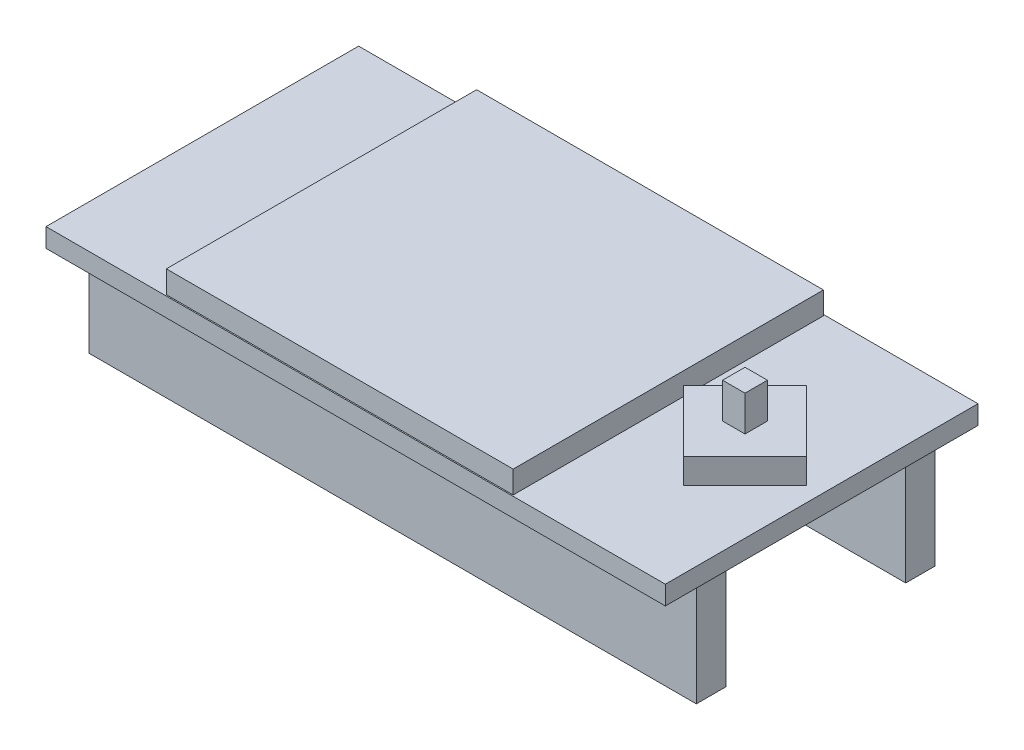
ISO-10303-21;
HEADER;
FILE_DESCRIPTION(('STEP AP214'),'2;1');
FILE_NAME('part.step','',(''),(''),'','','');
FILE_SCHEMA(('AUTOMOTIVE_DESIGN { 1 0 10303 214 1 1 1 1 }'));
ENDSEC;
DATA;
#1=APPLICATION_CONTEXT('core data for automotive mechanical design processes');
#2=APPLICATION_PROTOCOL_DEFINITION('international standard','automotive_design',2000,#1);
#3=PRODUCT_CONTEXT('',#1,'mechanical');
#4=PRODUCT('Part','Part','',(#3));
#5=PRODUCT_RELATED_PRODUCT_CATEGORY('part','',(#4));
#6=PRODUCT_DEFINITION_FORMATION('','',#4);
#7=PRODUCT_DEFINITION_CONTEXT('part definition',#1,'design');
#8=PRODUCT_DEFINITION('design','',#6,#7);
#9=PRODUCT_DEFINITION_SHAPE('','',#8);
#10=(LENGTH_UNIT() NAMED_UNIT(*) SI_UNIT(.MILLI.,.METRE.));
#11=(NAMED_UNIT(*) PLANE_ANGLE_UNIT() SI_UNIT($,.RADIAN.));
#12=(NAMED_UNIT(*) SI_UNIT($,.STERADIAN.) SOLID_ANGLE_UNIT());
#13=UNCERTAINTY_MEASURE_WITH_UNIT(LENGTH_MEASURE(1.E-05),#10,'distance_accuracy_value','');
#14=(GEOMETRIC_REPRESENTATION_CONTEXT(3) GLOBAL_UNCERTAINTY_ASSIGNED_CONTEXT((#13)) GLOBAL_UNIT_ASSIGNED_CONTEXT((#10,
#11,#12)) REPRESENTATION_CONTEXT('',''));
#15=CARTESIAN_POINT('',(0.,0.,0.));
#16=DIRECTION('',(0.,0.,1.));
#17=DIRECTION('',(1.,0.,0.));
#18=AXIS2_PLACEMENT_3D('',#15,#16,#17);
#19=CARTESIAN_POINT('',(0.,10.6,0.));
#20=DIRECTION('',(0.,1.,0.));
#21=DIRECTION('',(0.,0.,1.));
#22=AXIS2_PLACEMENT_3D('',#19,#20,#21);
#23=PLANE('',#22);
#24=DIRECTION('',(0.,0.,-1.));
#25=VECTOR('',#24,1.);
#26=CARTESIAN_POINT('',(13.25,10.6,-13.15));
#27=LINE('',#26,#25);
#28=CARTESIAN_POINT('',(13.25,10.6,13.15));
#29=VERTEX_POINT('',#28);
#30=CARTESIAN_POINT('',(13.25,10.6,-13.15));
#31=VERTEX_POINT('',#30);
#32=EDGE_CURVE('E248',#29,#31,#27,.T.);
#33=ORIENTED_EDGE('',*,*,#32,.F.);
#34=DIRECTION('',(1.,0.,0.));
#35=VECTOR('',#34,1.);
#36=CARTESIAN_POINT('',(-16.15,10.6,13.15));
#37=LINE('',#36,#35);
#38=CARTESIAN_POINT('',(-16.15,10.6,13.15));
#39=VERTEX_POINT('',#38);
#40=EDGE_CURVE('E253',#39,#29,#37,.T.);
#41=ORIENTED_EDGE('',*,*,#40,.F.);
#42=DIRECTION('',(0.,0.,1.));
#43=VECTOR('',#42,1.);
#44=CARTESIAN_POINT('',(-16.15,10.6,-13.15));
#45=LINE('',#44,#43);
#46=CARTESIAN_POINT('',(-16.15,10.6,-13.15));
#47=VERTEX_POINT('',#46);
#48=EDGE_CURVE('E265',#47,#39,#45,.T.);
#49=ORIENTED_EDGE('',*,*,#48,.F.);
#50=DIRECTION('',(-1.,0.,0.));
#51=VECTOR('',#50,1.);
#52=CARTESIAN_POINT('',(-16.15,10.6,-13.15));
#53=LINE('',#52,#51);
#54=EDGE_CURVE('E262',#31,#47,#53,.T.);
#55=ORIENTED_EDGE('',*,*,#54,.F.);
#56=EDGE_LOOP('',(#33,#41,#49,#55));
#57=FACE_BOUND('',#56,.T.);
#58=DIRECTION('',(0.,0.,1.));
#59=VECTOR('',#58,1.);
#60=CARTESIAN_POINT('',(-26.25,10.6,13.25));
#61=LINE('',#60,#59);
#62=CARTESIAN_POINT('',(-26.25,10.6,-13.25));
#63=VERTEX_POINT('',#62);
#64=CARTESIAN_POINT('',(-26.25,10.6,13.25));
#65=VERTEX_POINT('',#64);
#66=EDGE_CURVE('E311',#63,#65,#61,.T.);
#67=ORIENTED_EDGE('',*,*,#66,.T.);
#68=DIRECTION('',(1.,0.,0.));
#69=VECTOR('',#68,1.);
#70=CARTESIAN_POINT('',(26.25,10.6,13.25));
#71=LINE('',#70,#69);
#72=CARTESIAN_POINT('',(26.25,10.6,13.25));
#73=VERTEX_POINT('',#72);
#74=EDGE_CURVE('E314',#65,#73,#71,.T.);
#75=ORIENTED_EDGE('',*,*,#74,.T.);
#76=DIRECTION('',(0.,0.,-1.));
#77=VECTOR('',#76,1.);
#78=CARTESIAN_POINT('',(26.25,10.6,13.25));
#79=LINE('',#78,#77);
#80=CARTESIAN_POINT('',(26.25,10.6,-13.25));
#81=VERTEX_POINT('',#80);
#82=EDGE_CURVE('E317',#73,#81,#79,.T.);
#83=ORIENTED_EDGE('',*,*,#82,.T.);
#84=DIRECTION('',(-1.,0.,0.));
#85=VECTOR('',#84,1.);
#86=CARTESIAN_POINT('',(26.25,10.6,-13.25));
#87=LINE('',#86,#85);
#88=EDGE_CURVE('E319',#81,#63,#87,.T.);
#89=ORIENTED_EDGE('',*,*,#88,.T.);
#90=EDGE_LOOP('',(#67,#75,#83,#89));
#91=FACE_BOUND('',#90,.T.);
#92=DIRECTION('',(0.707106781186547,0.,-0.707106781186548));
#93=VECTOR('',#92,1.);
#94=CARTESIAN_POINT('',(24.9825901807804,10.6,0.));
#95=LINE('',#94,#93);
#96=CARTESIAN_POINT('',(19.75,10.6,5.23259018078045));
#97=VERTEX_POINT('',#96);
#98=CARTESIAN_POINT('',(24.9825901807804,10.6,0.));
#99=VERTEX_POINT('',#98);
#100=EDGE_CURVE('E217',#97,#99,#95,.T.);
#101=ORIENTED_EDGE('',*,*,#100,.F.);
#102=DIRECTION('',(0.707106781186548,0.,0.707106781186548));
#103=VECTOR('',#102,1.);
#104=CARTESIAN_POINT('',(19.75,10.6,5.23259018078045));
#105=LINE('',#104,#103);
#106=CARTESIAN_POINT('',(14.5174098192195,10.6,0.));
#107=VERTEX_POINT('',#106);
#108=EDGE_CURVE('E214',#107,#97,#105,.T.);
#109=ORIENTED_EDGE('',*,*,#108,.F.);
#110=DIRECTION('',(-0.707106781186547,0.,0.707106781186548));
#111=VECTOR('',#110,1.);
#112=CARTESIAN_POINT('',(19.75,10.6,-5.23259018078045));
#113=LINE('',#112,#111);
#114=CARTESIAN_POINT('',(19.75,10.6,-5.23259018078045));
#115=VERTEX_POINT('',#114);
#116=EDGE_CURVE('E227',#115,#107,#113,.T.);
#117=ORIENTED_EDGE('',*,*,#116,.F.);
#118=DIRECTION('',(-0.707106781186548,0.,-0.707106781186548));
#119=VECTOR('',#118,1.);
#120=CARTESIAN_POINT('',(24.9825901807804,10.6,0.));
#121=LINE('',#120,#119);
#122=EDGE_CURVE('E235',#99,#115,#121,.T.);
#123=ORIENTED_EDGE('',*,*,#122,.F.);
#124=EDGE_LOOP('',(#101,#109,#117,#123));
#125=FACE_BOUND('',#124,.T.);
#126=ADVANCED_FACE('F33',(#57,#91,#125),#23,.T.);
#127=CARTESIAN_POINT('',(0.,9.,0.));
#128=DIRECTION('',(0.,1.,0.));
#129=DIRECTION('',(0.,0.,1.));
#130=AXIS2_PLACEMENT_3D('',#127,#128,#129);
#131=PLANE('',#130);
#132=DIRECTION('',(-1.,0.,0.));
#133=VECTOR('',#132,1.);
#134=CARTESIAN_POINT('',(25.75,9.,-10.125));
#135=LINE('',#134,#133);
#136=CARTESIAN_POINT('',(25.75,9.,-10.125));
#137=VERTEX_POINT('',#136);
#138=CARTESIAN_POINT('',(-25.75,9.,-10.125));
#139=VERTEX_POINT('',#138);
#140=EDGE_CURVE('E351',#137,#139,#135,.T.);
#141=ORIENTED_EDGE('',*,*,#140,.T.);
#142=DIRECTION('',(0.,0.,1.));
#143=VECTOR('',#142,1.);
#144=CARTESIAN_POINT('',(-25.75,9.,-7.625));
#145=LINE('',#144,#143);
#146=CARTESIAN_POINT('',(-25.75,9.,-7.625));
#147=VERTEX_POINT('',#146);
#148=EDGE_CURVE('E341',#139,#147,#145,.T.);
#149=ORIENTED_EDGE('',*,*,#148,.T.);
#150=DIRECTION('',(1.,0.,0.));
#151=VECTOR('',#150,1.);
#152=CARTESIAN_POINT('',(25.75,9.,-7.625));
#153=LINE('',#152,#151);
#154=CARTESIAN_POINT('',(25.75,9.,-7.625));
#155=VERTEX_POINT('',#154);
#156=EDGE_CURVE('E344',#147,#155,#153,.T.);
#157=ORIENTED_EDGE('',*,*,#156,.T.);
#158=DIRECTION('',(0.,0.,-1.));
#159=VECTOR('',#158,1.);
#160=CARTESIAN_POINT('',(25.75,9.,-7.625));
#161=LINE('',#160,#159);
#162=EDGE_CURVE('E348',#155,#137,#161,.T.);
#163=ORIENTED_EDGE('',*,*,#162,.T.);
#164=EDGE_LOOP('',(#141,#149,#157,#163));
#165=FACE_BOUND('',#164,.T.);
#166=DIRECTION('',(0.,0.,1.));
#167=VECTOR('',#166,1.);
#168=CARTESIAN_POINT('',(-26.25,9.,13.25));
#169=LINE('',#168,#167);
#170=CARTESIAN_POINT('',(-26.25,9.,-13.25));
#171=VERTEX_POINT('',#170);
#172=CARTESIAN_POINT('',(-26.25,9.,13.25));
#173=VERTEX_POINT('',#172);
#174=EDGE_CURVE('E310',#171,#173,#169,.T.);
#175=ORIENTED_EDGE('',*,*,#174,.F.);
#176=DIRECTION('',(-1.,0.,0.));
#177=VECTOR('',#176,1.);
#178=CARTESIAN_POINT('',(26.25,9.,-13.25));
#179=LINE('',#178,#177);
#180=CARTESIAN_POINT('',(26.25,9.,-13.25));
#181=VERTEX_POINT('',#180);
#182=EDGE_CURVE('E315',#181,#171,#179,.T.);
#183=ORIENTED_EDGE('',*,*,#182,.F.);
#184=DIRECTION('',(0.,0.,-1.));
#185=VECTOR('',#184,1.);
#186=CARTESIAN_POINT('',(26.25,9.,13.25));
#187=LINE('',#186,#185);
#188=CARTESIAN_POINT('',(26.25,9.,13.25));
#189=VERTEX_POINT('',#188);
#190=EDGE_CURVE('E326',#189,#181,#187,.T.);
#191=ORIENTED_EDGE('',*,*,#190,.F.);
#192=DIRECTION('',(1.,0.,0.));
#193=VECTOR('',#192,1.);
#194=CARTESIAN_POINT('',(26.25,9.,13.25));
#195=LINE('',#194,#193);
#196=EDGE_CURVE('E324',#173,#189,#195,.T.);
#197=ORIENTED_EDGE('',*,*,#196,.F.);
#198=EDGE_LOOP('',(#175,#183,#191,#197));
#199=FACE_BOUND('',#198,.T.);
#200=DIRECTION('',(0.,0.,1.));
#201=VECTOR('',#200,1.);
#202=CARTESIAN_POINT('',(-25.75,9.,10.125));
#203=LINE('',#202,#201);
#204=CARTESIAN_POINT('',(-25.75,9.,7.625));
#205=VERTEX_POINT('',#204);
#206=CARTESIAN_POINT('',(-25.75,9.,10.125));
#207=VERTEX_POINT('',#206);
#208=EDGE_CURVE('E282',#205,#207,#203,.T.);
#209=ORIENTED_EDGE('',*,*,#208,.T.);
#210=DIRECTION('',(1.,0.,0.));
#211=VECTOR('',#210,1.);
#212=CARTESIAN_POINT('',(25.75,9.,10.125));
#213=LINE('',#212,#211);
#214=CARTESIAN_POINT('',(25.75,9.,10.125));
#215=VERTEX_POINT('',#214);
#216=EDGE_CURVE('E284',#207,#215,#213,.T.);
#217=ORIENTED_EDGE('',*,*,#216,.T.);
#218=DIRECTION('',(0.,0.,-1.));
#219=VECTOR('',#218,1.);
#220=CARTESIAN_POINT('',(25.75,9.,10.125));
#221=LINE('',#220,#219);
#222=CARTESIAN_POINT('',(25.75,9.,7.625));
#223=VERTEX_POINT('',#222);
#224=EDGE_CURVE('E287',#215,#223,#221,.T.);
#225=ORIENTED_EDGE('',*,*,#224,.T.);
#226=DIRECTION('',(-1.,0.,0.));
#227=VECTOR('',#226,1.);
#228=CARTESIAN_POINT('',(25.75,9.,7.625));
#229=LINE('',#228,#227);
#230=EDGE_CURVE('E289',#223,#205,#229,.T.);
#231=ORIENTED_EDGE('',*,*,#230,.T.);
#232=EDGE_LOOP('',(#209,#217,#225,#231));
#233=FACE_BOUND('',#232,.T.);
#234=ADVANCED_FACE('F383',(#165,#199,#233),#131,.F.);
#235=CARTESIAN_POINT('',(-25.75,9.,-7.625));
#236=DIRECTION('',(1.,0.,0.));
#237=DIRECTION('',(0.,0.,-1.));
#238=AXIS2_PLACEMENT_3D('',#235,#236,#237);
#239=PLANE('',#238);
#240=DIRECTION('',(0.,0.,1.));
#241=VECTOR('',#240,1.);
#242=CARTESIAN_POINT('',(-25.75,0.,-7.625));
#243=LINE('',#242,#241);
#244=CARTESIAN_POINT('',(-25.75,0.,-10.125));
#245=VERTEX_POINT('',#244);
#246=CARTESIAN_POINT('',(-25.75,0.,-7.625));
#247=VERTEX_POINT('',#246);
#248=EDGE_CURVE('E340',#245,#247,#243,.T.);
#249=ORIENTED_EDGE('',*,*,#248,.T.);
#250=DIRECTION('',(0.,-1.,0.));
#251=VECTOR('',#250,1.);
#252=CARTESIAN_POINT('',(-25.75,9.,-7.625));
#253=LINE('',#252,#251);
#254=EDGE_CURVE('E11',#147,#247,#253,.T.);
#255=ORIENTED_EDGE('',*,*,#254,.F.);
#256=ORIENTED_EDGE('',*,*,#148,.F.);
#257=DIRECTION('',(0.,-1.,0.));
#258=VECTOR('',#257,1.);
#259=CARTESIAN_POINT('',(-25.75,9.,-10.125));
#260=LINE('',#259,#258);
#261=EDGE_CURVE('E354',#139,#245,#260,.T.);
#262=ORIENTED_EDGE('',*,*,#261,.T.);
#263=EDGE_LOOP('',(#249,#255,#256,#262));
#264=FACE_BOUND('',#263,.T.);
#265=ADVANCED_FACE('F35',(#264),#239,.F.);
#266=CARTESIAN_POINT('',(25.75,9.,-7.625));
#267=DIRECTION('',(0.,0.,-1.));
#268=DIRECTION('',(-1.,0.,0.));
#269=AXIS2_PLACEMENT_3D('',#266,#267,#268);
#270=PLANE('',#269);
#271=DIRECTION('',(1.,0.,0.));
#272=VECTOR('',#271,1.);
#273=CARTESIAN_POINT('',(25.75,0.,-7.625));
#274=LINE('',#273,#272);
#275=CARTESIAN_POINT('',(25.75,0.,-7.625));
#276=VERTEX_POINT('',#275);
#277=EDGE_CURVE('E357',#247,#276,#274,.T.);
#278=ORIENTED_EDGE('',*,*,#277,.T.);
#279=DIRECTION('',(0.,-1.,0.));
#280=VECTOR('',#279,1.);
#281=CARTESIAN_POINT('',(25.75,9.,-7.625));
#282=LINE('',#281,#280);
#283=EDGE_CURVE('E41',#155,#276,#282,.T.);
#284=ORIENTED_EDGE('',*,*,#283,.F.);
#285=ORIENTED_EDGE('',*,*,#156,.F.);
#286=ORIENTED_EDGE('',*,*,#254,.T.);
#287=EDGE_LOOP('',(#278,#284,#285,#286));
#288=FACE_BOUND('',#287,.T.);
#289=ADVANCED_FACE('F385',(#288),#270,.F.);
#290=CARTESIAN_POINT('',(25.75,9.,-7.625));
#291=DIRECTION('',(-1.,0.,0.));
#292=DIRECTION('',(0.,0.,1.));
#293=AXIS2_PLACEMENT_3D('',#290,#291,#292);
#294=PLANE('',#293);
#295=DIRECTION('',(0.,0.,-1.));
#296=VECTOR('',#295,1.);
#297=CARTESIAN_POINT('',(25.75,0.,-7.625));
#298=LINE('',#297,#296);
#299=CARTESIAN_POINT('',(25.75,0.,-10.125));
#300=VERTEX_POINT('',#299);
#301=EDGE_CURVE('E359',#276,#300,#298,.T.);
#302=ORIENTED_EDGE('',*,*,#301,.T.);
#303=DIRECTION('',(0.,-1.,0.));
#304=VECTOR('',#303,1.);
#305=CARTESIAN_POINT('',(25.75,9.,-10.125));
#306=LINE('',#305,#304);
#307=EDGE_CURVE('E364',#137,#300,#306,.T.);
#308=ORIENTED_EDGE('',*,*,#307,.F.);
#309=ORIENTED_EDGE('',*,*,#162,.F.);
#310=ORIENTED_EDGE('',*,*,#283,.T.);
#311=EDGE_LOOP('',(#302,#308,#309,#310));
#312=FACE_BOUND('',#311,.T.);
#313=ADVANCED_FACE('F370',(#312),#294,.F.);
#314=CARTESIAN_POINT('',(25.75,9.,-10.125));
#315=DIRECTION('',(0.,0.,1.));
#316=DIRECTION('',(1.,0.,0.));
#317=AXIS2_PLACEMENT_3D('',#314,#315,#316);
#318=PLANE('',#317);
#319=DIRECTION('',(-1.,0.,0.));
#320=VECTOR('',#319,1.);
#321=CARTESIAN_POINT('',(25.75,0.,-10.125));
#322=LINE('',#321,#320);
#323=EDGE_CURVE('E345',#300,#245,#322,.T.);
#324=ORIENTED_EDGE('',*,*,#323,.T.);
#325=ORIENTED_EDGE('',*,*,#261,.F.);
#326=ORIENTED_EDGE('',*,*,#140,.F.);
#327=ORIENTED_EDGE('',*,*,#307,.T.);
#328=EDGE_LOOP('',(#324,#325,#326,#327));
#329=FACE_BOUND('',#328,.T.);
#330=ADVANCED_FACE('F378',(#329),#318,.F.);
#331=CARTESIAN_POINT('',(0.,0.,0.));
#332=DIRECTION('',(0.,1.,0.));
#333=DIRECTION('',(0.,0.,1.));
#334=AXIS2_PLACEMENT_3D('',#331,#332,#333);
#335=PLANE('',#334);
#336=ORIENTED_EDGE('',*,*,#248,.F.);
#337=ORIENTED_EDGE('',*,*,#323,.F.);
#338=ORIENTED_EDGE('',*,*,#301,.F.);
#339=ORIENTED_EDGE('',*,*,#277,.F.);
#340=EDGE_LOOP('',(#336,#337,#338,#339));
#341=FACE_BOUND('',#340,.T.);
#342=ADVANCED_FACE('F375',(#341),#335,.F.);
#343=CARTESIAN_POINT('',(-26.25,10.6,13.25));
#344=DIRECTION('',(1.,0.,0.));
#345=DIRECTION('',(0.,0.,-1.));
#346=AXIS2_PLACEMENT_3D('',#343,#344,#345);
#347=PLANE('',#346);
#348=ORIENTED_EDGE('',*,*,#174,.T.);
#349=DIRECTION('',(0.,-1.,0.));
#350=VECTOR('',#349,1.);
#351=CARTESIAN_POINT('',(-26.25,10.6,13.25));
#352=LINE('',#351,#350);
#353=EDGE_CURVE('E337',#65,#173,#352,.T.);
#354=ORIENTED_EDGE('',*,*,#353,.F.);
#355=ORIENTED_EDGE('',*,*,#66,.F.);
#356=DIRECTION('',(0.,-1.,0.));
#357=VECTOR('',#356,1.);
#358=CARTESIAN_POINT('',(-26.25,10.6,-13.25));
#359=LINE('',#358,#357);
#360=EDGE_CURVE('E321',#63,#171,#359,.T.);
#361=ORIENTED_EDGE('',*,*,#360,.T.);
#362=EDGE_LOOP('',(#348,#354,#355,#361));
#363=FACE_BOUND('',#362,.T.);
#364=ADVANCED_FACE('F415',(#363),#347,.F.);
#365=CARTESIAN_POINT('',(26.25,10.6,13.25));
#366=DIRECTION('',(0.,0.,-1.));
#367=DIRECTION('',(-1.,0.,0.));
#368=AXIS2_PLACEMENT_3D('',#365,#366,#367);
#369=PLANE('',#368);
#370=ORIENTED_EDGE('',*,*,#196,.T.);
#371=DIRECTION('',(0.,-1.,0.));
#372=VECTOR('',#371,1.);
#373=CARTESIAN_POINT('',(26.25,10.6,13.25));
#374=LINE('',#373,#372);
#375=EDGE_CURVE('E334',#73,#189,#374,.T.);
#376=ORIENTED_EDGE('',*,*,#375,.F.);
#377=ORIENTED_EDGE('',*,*,#74,.F.);
#378=ORIENTED_EDGE('',*,*,#353,.T.);
#379=EDGE_LOOP('',(#370,#376,#377,#378));
#380=FACE_BOUND('',#379,.T.);
#381=ADVANCED_FACE('F411',(#380),#369,.F.);
#382=CARTESIAN_POINT('',(26.25,10.6,13.25));
#383=DIRECTION('',(-1.,0.,0.));
#384=DIRECTION('',(0.,0.,1.));
#385=AXIS2_PLACEMENT_3D('',#382,#383,#384);
#386=PLANE('',#385);
#387=ORIENTED_EDGE('',*,*,#190,.T.);
#388=DIRECTION('',(0.,-1.,0.));
#389=VECTOR('',#388,1.);
#390=CARTESIAN_POINT('',(26.25,10.6,-13.25));
#391=LINE('',#390,#389);
#392=EDGE_CURVE('E331',#81,#181,#391,.T.);
#393=ORIENTED_EDGE('',*,*,#392,.F.);
#394=ORIENTED_EDGE('',*,*,#82,.F.);
#395=ORIENTED_EDGE('',*,*,#375,.T.);
#396=EDGE_LOOP('',(#387,#393,#394,#395));
#397=FACE_BOUND('',#396,.T.);
#398=ADVANCED_FACE('F407',(#397),#386,.F.);
#399=CARTESIAN_POINT('',(26.25,10.6,-13.25));
#400=DIRECTION('',(0.,0.,1.));
#401=DIRECTION('',(1.,0.,0.));
#402=AXIS2_PLACEMENT_3D('',#399,#400,#401);
#403=PLANE('',#402);
#404=ORIENTED_EDGE('',*,*,#182,.T.);
#405=ORIENTED_EDGE('',*,*,#360,.F.);
#406=ORIENTED_EDGE('',*,*,#88,.F.);
#407=ORIENTED_EDGE('',*,*,#392,.T.);
#408=EDGE_LOOP('',(#404,#405,#406,#407));
#409=FACE_BOUND('',#408,.T.);
#410=ADVANCED_FACE('F404',(#409),#403,.F.);
#411=CARTESIAN_POINT('',(-25.75,9.,10.125));
#412=DIRECTION('',(1.,0.,0.));
#413=DIRECTION('',(0.,0.,-1.));
#414=AXIS2_PLACEMENT_3D('',#411,#412,#413);
#415=PLANE('',#414);
#416=DIRECTION('',(0.,0.,1.));
#417=VECTOR('',#416,1.);
#418=CARTESIAN_POINT('',(-25.75,0.,10.125));
#419=LINE('',#418,#417);
#420=CARTESIAN_POINT('',(-25.75,0.,7.625));
#421=VERTEX_POINT('',#420);
#422=CARTESIAN_POINT('',(-25.75,0.,10.125));
#423=VERTEX_POINT('',#422);
#424=EDGE_CURVE('E281',#421,#423,#419,.T.);
#425=ORIENTED_EDGE('',*,*,#424,.T.);
#426=DIRECTION('',(0.,-1.,0.));
#427=VECTOR('',#426,1.);
#428=CARTESIAN_POINT('',(-25.75,9.,10.125));
#429=LINE('',#428,#427);
#430=EDGE_CURVE('E307',#207,#423,#429,.T.);
#431=ORIENTED_EDGE('',*,*,#430,.F.);
#432=ORIENTED_EDGE('',*,*,#208,.F.);
#433=DIRECTION('',(0.,-1.,0.));
#434=VECTOR('',#433,1.);
#435=CARTESIAN_POINT('',(-25.75,9.,7.625));
#436=LINE('',#435,#434);
#437=EDGE_CURVE('E291',#205,#421,#436,.T.);
#438=ORIENTED_EDGE('',*,*,#437,.T.);
#439=EDGE_LOOP('',(#425,#431,#432,#438));
#440=FACE_BOUND('',#439,.T.);
#441=ADVANCED_FACE('F401',(#440),#415,.F.);
#442=CARTESIAN_POINT('',(25.75,9.,10.125));
#443=DIRECTION('',(0.,0.,-1.));
#444=DIRECTION('',(-1.,0.,0.));
#445=AXIS2_PLACEMENT_3D('',#442,#443,#444);
#446=PLANE('',#445);
#447=DIRECTION('',(1.,0.,0.));
#448=VECTOR('',#447,1.);
#449=CARTESIAN_POINT('',(25.75,0.,10.125));
#450=LINE('',#449,#448);
#451=CARTESIAN_POINT('',(25.75,0.,10.125));
#452=VERTEX_POINT('',#451);
#453=EDGE_CURVE('E294',#423,#452,#450,.T.);
#454=ORIENTED_EDGE('',*,*,#453,.T.);
#455=DIRECTION('',(0.,-1.,0.));
#456=VECTOR('',#455,1.);
#457=CARTESIAN_POINT('',(25.75,9.,10.125));
#458=LINE('',#457,#456);
#459=EDGE_CURVE('E304',#215,#452,#458,.T.);
#460=ORIENTED_EDGE('',*,*,#459,.F.);
#461=ORIENTED_EDGE('',*,*,#216,.F.);
#462=ORIENTED_EDGE('',*,*,#430,.T.);
#463=EDGE_LOOP('',(#454,#460,#461,#462));
#464=FACE_BOUND('',#463,.T.);
#465=ADVANCED_FACE('F454',(#464),#446,.F.);
#466=CARTESIAN_POINT('',(25.75,9.,10.125));
#467=DIRECTION('',(-1.,0.,0.));
#468=DIRECTION('',(0.,0.,1.));
#469=AXIS2_PLACEMENT_3D('',#466,#467,#468);
#470=PLANE('',#469);
#471=DIRECTION('',(0.,0.,-1.));
#472=VECTOR('',#471,1.);
#473=CARTESIAN_POINT('',(25.75,0.,10.125));
#474=LINE('',#473,#472);
#475=CARTESIAN_POINT('',(25.75,0.,7.625));
#476=VERTEX_POINT('',#475);
#477=EDGE_CURVE('E296',#452,#476,#474,.T.);
#478=ORIENTED_EDGE('',*,*,#477,.T.);
#479=DIRECTION('',(0.,-1.,0.));
#480=VECTOR('',#479,1.);
#481=CARTESIAN_POINT('',(25.75,9.,7.625));
#482=LINE('',#481,#480);
#483=EDGE_CURVE('E301',#223,#476,#482,.T.);
#484=ORIENTED_EDGE('',*,*,#483,.F.);
#485=ORIENTED_EDGE('',*,*,#224,.F.);
#486=ORIENTED_EDGE('',*,*,#459,.T.);
#487=EDGE_LOOP('',(#478,#484,#485,#486));
#488=FACE_BOUND('',#487,.T.);
#489=ADVANCED_FACE('F461',(#488),#470,.F.);
#490=CARTESIAN_POINT('',(25.75,9.,7.625));
#491=DIRECTION('',(0.,0.,1.));
#492=DIRECTION('',(1.,0.,0.));
#493=AXIS2_PLACEMENT_3D('',#490,#491,#492);
#494=PLANE('',#493);
#495=DIRECTION('',(-1.,0.,0.));
#496=VECTOR('',#495,1.);
#497=CARTESIAN_POINT('',(25.75,0.,7.625));
#498=LINE('',#497,#496);
#499=EDGE_CURVE('E285',#476,#421,#498,.T.);
#500=ORIENTED_EDGE('',*,*,#499,.T.);
#501=ORIENTED_EDGE('',*,*,#437,.F.);
#502=ORIENTED_EDGE('',*,*,#230,.F.);
#503=ORIENTED_EDGE('',*,*,#483,.T.);
#504=EDGE_LOOP('',(#500,#501,#502,#503));
#505=FACE_BOUND('',#504,.T.);
#506=ADVANCED_FACE('F468',(#505),#494,.F.);
#507=CARTESIAN_POINT('',(0.,0.,0.));
#508=DIRECTION('',(0.,1.,0.));
#509=DIRECTION('',(0.,0.,1.));
#510=AXIS2_PLACEMENT_3D('',#507,#508,#509);
#511=PLANE('',#510);
#512=ORIENTED_EDGE('',*,*,#424,.F.);
#513=ORIENTED_EDGE('',*,*,#499,.F.);
#514=ORIENTED_EDGE('',*,*,#477,.F.);
#515=ORIENTED_EDGE('',*,*,#453,.F.);
#516=EDGE_LOOP('',(#512,#513,#514,#515));
#517=FACE_BOUND('',#516,.T.);
#518=ADVANCED_FACE('F476',(#517),#511,.F.);
#519=CARTESIAN_POINT('',(13.25,12.5,-13.15));
#520=DIRECTION('',(-1.,0.,0.));
#521=DIRECTION('',(0.,0.,1.));
#522=AXIS2_PLACEMENT_3D('',#519,#520,#521);
#523=PLANE('',#522);
#524=ORIENTED_EDGE('',*,*,#32,.T.);
#525=DIRECTION('',(0.,-1.,0.));
#526=VECTOR('',#525,1.);
#527=CARTESIAN_POINT('',(13.25,12.5,-13.15));
#528=LINE('',#527,#526);
#529=CARTESIAN_POINT('',(13.25,12.5,-13.15));
#530=VERTEX_POINT('',#529);
#531=EDGE_CURVE('E278',#530,#31,#528,.T.);
#532=ORIENTED_EDGE('',*,*,#531,.F.);
#533=DIRECTION('',(0.,0.,-1.));
#534=VECTOR('',#533,1.);
#535=CARTESIAN_POINT('',(13.25,12.5,-13.15));
#536=LINE('',#535,#534);
#537=CARTESIAN_POINT('',(13.25,12.5,13.15));
#538=VERTEX_POINT('',#537);
#539=EDGE_CURVE('E249',#538,#530,#536,.T.);
#540=ORIENTED_EDGE('',*,*,#539,.F.);
#541=DIRECTION('',(0.,-1.,0.));
#542=VECTOR('',#541,1.);
#543=CARTESIAN_POINT('',(13.25,12.5,13.15));
#544=LINE('',#543,#542);
#545=EDGE_CURVE('E259',#538,#29,#544,.T.);
#546=ORIENTED_EDGE('',*,*,#545,.T.);
#547=EDGE_LOOP('',(#524,#532,#540,#546));
#548=FACE_BOUND('',#547,.T.);
#549=ADVANCED_FACE('F484',(#548),#523,.F.);
#550=CARTESIAN_POINT('',(-16.15,12.5,-13.15));
#551=DIRECTION('',(0.,0.,1.));
#552=DIRECTION('',(1.,0.,0.));
#553=AXIS2_PLACEMENT_3D('',#550,#551,#552);
#554=PLANE('',#553);
#555=ORIENTED_EDGE('',*,*,#54,.T.);
#556=DIRECTION('',(0.,-1.,0.));
#557=VECTOR('',#556,1.);
#558=CARTESIAN_POINT('',(-16.15,12.5,-13.15));
#559=LINE('',#558,#557);
#560=CARTESIAN_POINT('',(-16.15,12.5,-13.15));
#561=VERTEX_POINT('',#560);
#562=EDGE_CURVE('E275',#561,#47,#559,.T.);
#563=ORIENTED_EDGE('',*,*,#562,.F.);
#564=DIRECTION('',(-1.,0.,0.));
#565=VECTOR('',#564,1.);
#566=CARTESIAN_POINT('',(-16.15,12.5,-13.15));
#567=LINE('',#566,#565);
#568=EDGE_CURVE('E252',#530,#561,#567,.T.);
#569=ORIENTED_EDGE('',*,*,#568,.F.);
#570=ORIENTED_EDGE('',*,*,#531,.T.);
#571=EDGE_LOOP('',(#555,#563,#569,#570));
#572=FACE_BOUND('',#571,.T.);
#573=ADVANCED_FACE('F492',(#572),#554,.F.);
#574=CARTESIAN_POINT('',(-16.15,12.5,-13.15));
#575=DIRECTION('',(1.,0.,0.));
#576=DIRECTION('',(0.,0.,-1.));
#577=AXIS2_PLACEMENT_3D('',#574,#575,#576);
#578=PLANE('',#577);
#579=ORIENTED_EDGE('',*,*,#48,.T.);
#580=DIRECTION('',(0.,-1.,0.));
#581=VECTOR('',#580,1.);
#582=CARTESIAN_POINT('',(-16.15,12.5,13.15));
#583=LINE('',#582,#581);
#584=CARTESIAN_POINT('',(-16.15,12.5,13.15));
#585=VERTEX_POINT('',#584);
#586=EDGE_CURVE('E272',#585,#39,#583,.T.);
#587=ORIENTED_EDGE('',*,*,#586,.F.);
#588=DIRECTION('',(0.,0.,1.));
#589=VECTOR('',#588,1.);
#590=CARTESIAN_POINT('',(-16.15,12.5,-13.15));
#591=LINE('',#590,#589);
#592=EDGE_CURVE('E255',#561,#585,#591,.T.);
#593=ORIENTED_EDGE('',*,*,#592,.F.);
#594=ORIENTED_EDGE('',*,*,#562,.T.);
#595=EDGE_LOOP('',(#579,#587,#593,#594));
#596=FACE_BOUND('',#595,.T.);
#597=ADVANCED_FACE('F500',(#596),#578,.F.);
#598=CARTESIAN_POINT('',(-16.15,12.5,13.15));
#599=DIRECTION('',(0.,0.,-1.));
#600=DIRECTION('',(-1.,0.,0.));
#601=AXIS2_PLACEMENT_3D('',#598,#599,#600);
#602=PLANE('',#601);
#603=ORIENTED_EDGE('',*,*,#40,.T.);
#604=ORIENTED_EDGE('',*,*,#545,.F.);
#605=DIRECTION('',(1.,0.,0.));
#606=VECTOR('',#605,1.);
#607=CARTESIAN_POINT('',(-16.15,12.5,13.15));
#608=LINE('',#607,#606);
#609=EDGE_CURVE('E257',#585,#538,#608,.T.);
#610=ORIENTED_EDGE('',*,*,#609,.F.);
#611=ORIENTED_EDGE('',*,*,#586,.T.);
#612=EDGE_LOOP('',(#603,#604,#610,#611));
#613=FACE_BOUND('',#612,.T.);
#614=ADVANCED_FACE('F508',(#613),#602,.F.);
#615=CARTESIAN_POINT('',(0.,12.5,0.));
#616=DIRECTION('',(0.,1.,0.));
#617=DIRECTION('',(0.,0.,1.));
#618=AXIS2_PLACEMENT_3D('',#615,#616,#617);
#619=PLANE('',#618);
#620=ORIENTED_EDGE('',*,*,#539,.T.);
#621=ORIENTED_EDGE('',*,*,#568,.T.);
#622=ORIENTED_EDGE('',*,*,#592,.T.);
#623=ORIENTED_EDGE('',*,*,#609,.T.);
#624=EDGE_LOOP('',(#620,#621,#622,#623));
#625=FACE_BOUND('',#624,.T.);
#626=ADVANCED_FACE('F516',(#625),#619,.T.);
#627=CARTESIAN_POINT('',(19.75,12.7,5.23259018078045));
#628=DIRECTION('',(0.707106781186548,0.,-0.707106781186548));
#629=DIRECTION('',(-0.707106781186548,0.,-0.707106781186548));
#630=AXIS2_PLACEMENT_3D('',#627,#628,#629);
#631=PLANE('',#630);
#632=ORIENTED_EDGE('',*,*,#108,.T.);
#633=DIRECTION('',(0.,-1.,0.));
#634=VECTOR('',#633,1.);
#635=CARTESIAN_POINT('',(19.75,12.7,5.23259018078045));
#636=LINE('',#635,#634);
#637=CARTESIAN_POINT('',(19.75,12.7,5.23259018078045));
#638=VERTEX_POINT('',#637);
#639=EDGE_CURVE('E246',#638,#97,#636,.T.);
#640=ORIENTED_EDGE('',*,*,#639,.F.);
#641=DIRECTION('',(0.707106781186548,0.,0.707106781186548));
#642=VECTOR('',#641,1.);
#643=CARTESIAN_POINT('',(19.75,12.7,5.23259018078045));
#644=LINE('',#643,#642);
#645=CARTESIAN_POINT('',(14.5174098192195,12.7,0.));
#646=VERTEX_POINT('',#645);
#647=EDGE_CURVE('E223',#646,#638,#644,.T.);
#648=ORIENTED_EDGE('',*,*,#647,.F.);
#649=DIRECTION('',(0.,-1.,0.));
#650=VECTOR('',#649,1.);
#651=CARTESIAN_POINT('',(14.5174098192195,12.7,0.));
#652=LINE('',#651,#650);
#653=EDGE_CURVE('E232',#646,#107,#652,.T.);
#654=ORIENTED_EDGE('',*,*,#653,.T.);
#655=EDGE_LOOP('',(#632,#640,#648,#654));
#656=FACE_BOUND('',#655,.T.);
#657=ADVANCED_FACE('F524',(#656),#631,.F.);
#658=CARTESIAN_POINT('',(24.9825901807804,12.7,0.));
#659=DIRECTION('',(-0.707106781186548,0.,-0.707106781186547));
#660=DIRECTION('',(-0.707106781186547,0.,0.707106781186548));
#661=AXIS2_PLACEMENT_3D('',#658,#659,#660);
#662=PLANE('',#661);
#663=ORIENTED_EDGE('',*,*,#100,.T.);
#664=DIRECTION('',(0.,-1.,0.));
#665=VECTOR('',#664,1.);
#666=CARTESIAN_POINT('',(24.9825901807804,12.7,0.));
#667=LINE('',#666,#665);
#668=CARTESIAN_POINT('',(24.9825901807804,12.7,0.));
#669=VERTEX_POINT('',#668);
#670=EDGE_CURVE('E243',#669,#99,#667,.T.);
#671=ORIENTED_EDGE('',*,*,#670,.F.);
#672=DIRECTION('',(0.707106781186547,0.,-0.707106781186548));
#673=VECTOR('',#672,1.);
#674=CARTESIAN_POINT('',(24.9825901807804,12.7,0.));
#675=LINE('',#674,#673);
#676=EDGE_CURVE('E226',#638,#669,#675,.T.);
#677=ORIENTED_EDGE('',*,*,#676,.F.);
#678=ORIENTED_EDGE('',*,*,#639,.T.);
#679=EDGE_LOOP('',(#663,#671,#677,#678));
#680=FACE_BOUND('',#679,.T.);
#681=ADVANCED_FACE('F532',(#680),#662,.F.);
#682=CARTESIAN_POINT('',(24.9825901807804,12.7,0.));
#683=DIRECTION('',(-0.707106781186548,0.,0.707106781186548));
#684=DIRECTION('',(0.707106781186548,0.,0.707106781186548));
#685=AXIS2_PLACEMENT_3D('',#682,#683,#684);
#686=PLANE('',#685);
#687=ORIENTED_EDGE('',*,*,#122,.T.);
#688=DIRECTION('',(0.,-1.,0.));
#689=VECTOR('',#688,1.);
#690=CARTESIAN_POINT('',(19.75,12.7,-5.23259018078045));
#691=LINE('',#690,#689);
#692=CARTESIAN_POINT('',(19.75,12.7,-5.23259018078045));
#693=VERTEX_POINT('',#692);
#694=EDGE_CURVE('E241',#693,#115,#691,.T.);
#695=ORIENTED_EDGE('',*,*,#694,.F.);
#696=DIRECTION('',(-0.707106781186548,0.,-0.707106781186548));
#697=VECTOR('',#696,1.);
#698=CARTESIAN_POINT('',(24.9825901807804,12.7,0.));
#699=LINE('',#698,#697);
#700=EDGE_CURVE('E229',#669,#693,#699,.T.);
#701=ORIENTED_EDGE('',*,*,#700,.F.);
#702=ORIENTED_EDGE('',*,*,#670,.T.);
#703=EDGE_LOOP('',(#687,#695,#701,#702));
#704=FACE_BOUND('',#703,.T.);
#705=ADVANCED_FACE('F540',(#704),#686,.F.);
#706=CARTESIAN_POINT('',(19.75,12.7,-5.23259018078045));
#707=DIRECTION('',(0.707106781186548,0.,0.707106781186547));
#708=DIRECTION('',(0.707106781186547,0.,-0.707106781186548));
#709=AXIS2_PLACEMENT_3D('',#706,#707,#708);
#710=PLANE('',#709);
#711=ORIENTED_EDGE('',*,*,#116,.T.);
#712=ORIENTED_EDGE('',*,*,#653,.F.);
#713=DIRECTION('',(-0.707106781186547,0.,0.707106781186548));
#714=VECTOR('',#713,1.);
#715=CARTESIAN_POINT('',(19.75,12.7,-5.23259018078045));
#716=LINE('',#715,#714);
#717=EDGE_CURVE('E231',#693,#646,#716,.T.);
#718=ORIENTED_EDGE('',*,*,#717,.F.);
#719=ORIENTED_EDGE('',*,*,#694,.T.);
#720=EDGE_LOOP('',(#711,#712,#718,#719));
#721=FACE_BOUND('',#720,.T.);
#722=ADVANCED_FACE('F548',(#721),#710,.F.);
#723=CARTESIAN_POINT('',(0.,12.7,0.));
#724=DIRECTION('',(0.,1.,0.));
#725=DIRECTION('',(0.,0.,1.));
#726=AXIS2_PLACEMENT_3D('',#723,#724,#725);
#727=PLANE('',#726);
#728=DIRECTION('',(0.,0.,-1.));
#729=VECTOR('',#728,1.);
#730=CARTESIAN_POINT('',(20.7,12.7,-0.95));
#731=LINE('',#730,#729);
#732=CARTESIAN_POINT('',(20.7,12.7,0.95));
#733=VERTEX_POINT('',#732);
#734=CARTESIAN_POINT('',(20.7,12.7,-0.95));
#735=VERTEX_POINT('',#734);
#736=EDGE_CURVE('E48',#733,#735,#731,.T.);
#737=ORIENTED_EDGE('',*,*,#736,.F.);
#738=DIRECTION('',(1.,0.,0.));
#739=VECTOR('',#738,1.);
#740=CARTESIAN_POINT('',(18.8,12.7,0.95));
#741=LINE('',#740,#739);
#742=CARTESIAN_POINT('',(18.8,12.7,0.95));
#743=VERTEX_POINT('',#742);
#744=EDGE_CURVE('E52',#743,#733,#741,.T.);
#745=ORIENTED_EDGE('',*,*,#744,.F.);
#746=DIRECTION('',(0.,0.,1.));
#747=VECTOR('',#746,1.);
#748=CARTESIAN_POINT('',(18.8,12.7,-0.95));
#749=LINE('',#748,#747);
#750=CARTESIAN_POINT('',(18.8,12.7,-0.95));
#751=VERTEX_POINT('',#750);
#752=EDGE_CURVE('E678',#751,#743,#749,.T.);
#753=ORIENTED_EDGE('',*,*,#752,.F.);
#754=DIRECTION('',(-1.,0.,0.));
#755=VECTOR('',#754,1.);
#756=CARTESIAN_POINT('',(18.8,12.7,-0.95));
#757=LINE('',#756,#755);
#758=EDGE_CURVE('E684',#735,#751,#757,.T.);
#759=ORIENTED_EDGE('',*,*,#758,.F.);
#760=EDGE_LOOP('',(#737,#745,#753,#759));
#761=FACE_BOUND('',#760,.T.);
#762=ORIENTED_EDGE('',*,*,#647,.T.);
#763=ORIENTED_EDGE('',*,*,#676,.T.);
#764=ORIENTED_EDGE('',*,*,#700,.T.);
#765=ORIENTED_EDGE('',*,*,#717,.T.);
#766=EDGE_LOOP('',(#762,#763,#764,#765));
#767=FACE_BOUND('',#766,.T.);
#768=ADVANCED_FACE('F556',(#761,#767),#727,.T.);
#769=CARTESIAN_POINT('',(20.7,15.7,-0.95));
#770=DIRECTION('',(-1.,0.,0.));
#771=DIRECTION('',(0.,0.,1.));
#772=AXIS2_PLACEMENT_3D('',#769,#770,#771);
#773=PLANE('',#772);
#774=ORIENTED_EDGE('',*,*,#736,.T.);
#775=DIRECTION('',(0.,-1.,0.));
#776=VECTOR('',#775,1.);
#777=CARTESIAN_POINT('',(20.7,15.7,-0.95));
#778=LINE('',#777,#776);
#779=CARTESIAN_POINT('',(20.7,15.7,-0.95));
#780=VERTEX_POINT('',#779);
#781=EDGE_CURVE('E197',#780,#735,#778,.T.);
#782=ORIENTED_EDGE('',*,*,#781,.F.);
#783=DIRECTION('',(0.,0.,-1.));
#784=VECTOR('',#783,1.);
#785=CARTESIAN_POINT('',(20.7,15.7,-0.95));
#786=LINE('',#785,#784);
#787=CARTESIAN_POINT('',(20.7,15.7,0.95));
#788=VERTEX_POINT('',#787);
#789=EDGE_CURVE('E203',#788,#780,#786,.T.);
#790=ORIENTED_EDGE('',*,*,#789,.F.);
#791=DIRECTION('',(0.,-1.,0.));
#792=VECTOR('',#791,1.);
#793=CARTESIAN_POINT('',(20.7,15.7,0.95));
#794=LINE('',#793,#792);
#795=EDGE_CURVE('E676',#788,#733,#794,.T.);
#796=ORIENTED_EDGE('',*,*,#795,.T.);
#797=EDGE_LOOP('',(#774,#782,#790,#796));
#798=FACE_BOUND('',#797,.T.);
#799=ADVANCED_FACE('F213',(#798),#773,.F.);
#800=CARTESIAN_POINT('',(18.8,15.7,-0.95));
#801=DIRECTION('',(0.,0.,1.));
#802=DIRECTION('',(1.,0.,0.));
#803=AXIS2_PLACEMENT_3D('',#800,#801,#802);
#804=PLANE('',#803);
#805=ORIENTED_EDGE('',*,*,#758,.T.);
#806=DIRECTION('',(0.,-1.,0.));
#807=VECTOR('',#806,1.);
#808=CARTESIAN_POINT('',(18.8,15.7,-0.95));
#809=LINE('',#808,#807);
#810=CARTESIAN_POINT('',(18.8,15.7,-0.95));
#811=VERTEX_POINT('',#810);
#812=EDGE_CURVE('E199',#811,#751,#809,.T.);
#813=ORIENTED_EDGE('',*,*,#812,.F.);
#814=DIRECTION('',(-1.,0.,0.));
#815=VECTOR('',#814,1.);
#816=CARTESIAN_POINT('',(18.8,15.7,-0.95));
#817=LINE('',#816,#815);
#818=EDGE_CURVE('E192',#780,#811,#817,.T.);
#819=ORIENTED_EDGE('',*,*,#818,.F.);
#820=ORIENTED_EDGE('',*,*,#781,.T.);
#821=EDGE_LOOP('',(#805,#813,#819,#820));
#822=FACE_BOUND('',#821,.T.);
#823=ADVANCED_FACE('F195',(#822),#804,.F.);
#824=CARTESIAN_POINT('',(18.8,15.7,-0.95));
#825=DIRECTION('',(1.,0.,0.));
#826=DIRECTION('',(0.,0.,-1.));
#827=AXIS2_PLACEMENT_3D('',#824,#825,#826);
#828=PLANE('',#827);
#829=ORIENTED_EDGE('',*,*,#752,.T.);
#830=DIRECTION('',(0.,-1.,0.));
#831=VECTOR('',#830,1.);
#832=CARTESIAN_POINT('',(18.8,15.7,0.95));
#833=LINE('',#832,#831);
#834=CARTESIAN_POINT('',(18.8,15.7,0.95));
#835=VERTEX_POINT('',#834);
#836=EDGE_CURVE('E219',#835,#743,#833,.T.);
#837=ORIENTED_EDGE('',*,*,#836,.F.);
#838=DIRECTION('',(0.,0.,1.));
#839=VECTOR('',#838,1.);
#840=CARTESIAN_POINT('',(18.8,15.7,-0.95));
#841=LINE('',#840,#839);
#842=EDGE_CURVE('E202',#811,#835,#841,.T.);
#843=ORIENTED_EDGE('',*,*,#842,.F.);
#844=ORIENTED_EDGE('',*,*,#812,.T.);
#845=EDGE_LOOP('',(#829,#837,#843,#844));
#846=FACE_BOUND('',#845,.T.);
#847=ADVANCED_FACE('F576',(#846),#828,.F.);
#848=CARTESIAN_POINT('',(18.8,15.7,0.95));
#849=DIRECTION('',(0.,0.,-1.));
#850=DIRECTION('',(-1.,0.,0.));
#851=AXIS2_PLACEMENT_3D('',#848,#849,#850);
#852=PLANE('',#851);
#853=ORIENTED_EDGE('',*,*,#744,.T.);
#854=ORIENTED_EDGE('',*,*,#795,.F.);
#855=DIRECTION('',(1.,0.,0.));
#856=VECTOR('',#855,1.);
#857=CARTESIAN_POINT('',(18.8,15.7,0.95));
#858=LINE('',#857,#856);
#859=EDGE_CURVE('E208',#835,#788,#858,.T.);
#860=ORIENTED_EDGE('',*,*,#859,.F.);
#861=ORIENTED_EDGE('',*,*,#836,.T.);
#862=EDGE_LOOP('',(#853,#854,#860,#861));
#863=FACE_BOUND('',#862,.T.);
#864=ADVANCED_FACE('F583',(#863),#852,.F.);
#865=CARTESIAN_POINT('',(0.,15.7,0.));
#866=DIRECTION('',(0.,1.,0.));
#867=DIRECTION('',(0.,0.,1.));
#868=AXIS2_PLACEMENT_3D('',#865,#866,#867);
#869=PLANE('',#868);
#870=ORIENTED_EDGE('',*,*,#789,.T.);
#871=ORIENTED_EDGE('',*,*,#818,.T.);
#872=ORIENTED_EDGE('',*,*,#842,.T.);
#873=ORIENTED_EDGE('',*,*,#859,.T.);
#874=EDGE_LOOP('',(#870,#871,#872,#873));
#875=FACE_BOUND('',#874,.T.);
#876=ADVANCED_FACE('F206',(#875),#869,.T.);
#877=CLOSED_SHELL('',(#126,#234,#265,#289,#313,#330,#342,#364,#381,#398,#410,#441,#465,#489,
#506,#518,#549,#573,#597,#614,#626,#657,#681,#705,#722,#768,#799,#823,#847,#864,#876));
#878=MANIFOLD_SOLID_BREP('B2',#877);
#879=ADVANCED_BREP_SHAPE_REPRESENTATION('',(#18,#878),#14);
#880=SHAPE_DEFINITION_REPRESENTATION(#9,#879);
ENDSEC;
END-ISO-10303-21;
